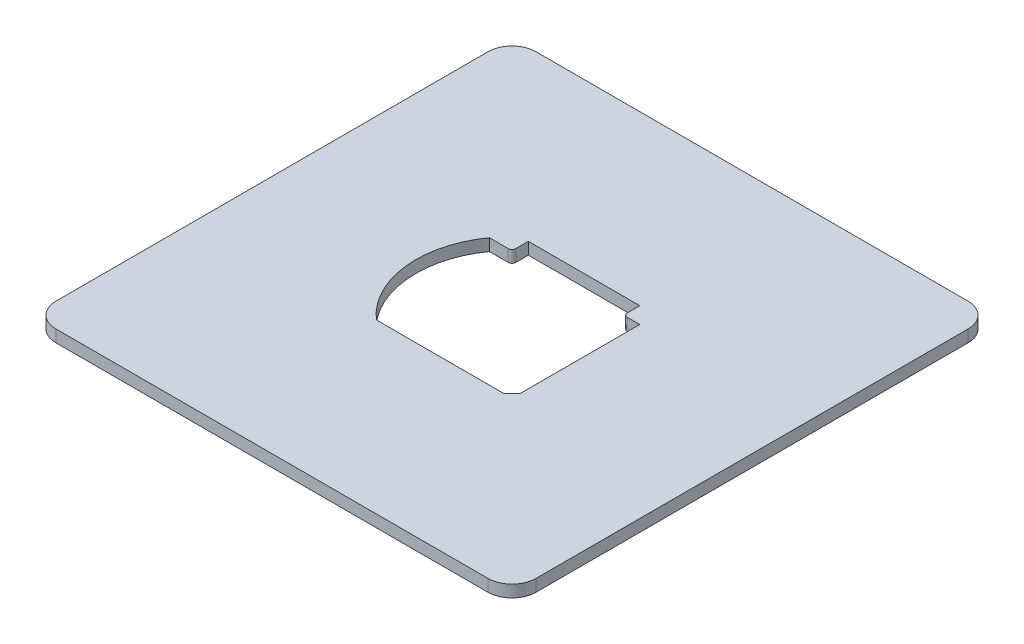
ISO-10303-21;
HEADER;
FILE_DESCRIPTION(('STEP AP214'),'2;1');
FILE_NAME('part.step','',(''),(''),'','','');
FILE_SCHEMA(('AUTOMOTIVE_DESIGN { 1 0 10303 214 1 1 1 1 }'));
ENDSEC;
DATA;
#1=APPLICATION_CONTEXT('core data for automotive mechanical design processes');
#2=APPLICATION_PROTOCOL_DEFINITION('international standard','automotive_design',2000,#1);
#3=PRODUCT_CONTEXT('',#1,'mechanical');
#4=PRODUCT('Part','Part','',(#3));
#5=PRODUCT_RELATED_PRODUCT_CATEGORY('part','',(#4));
#6=PRODUCT_DEFINITION_FORMATION('','',#4);
#7=PRODUCT_DEFINITION_CONTEXT('part definition',#1,'design');
#8=PRODUCT_DEFINITION('design','',#6,#7);
#9=PRODUCT_DEFINITION_SHAPE('','',#8);
#10=(LENGTH_UNIT() NAMED_UNIT(*) SI_UNIT(.MILLI.,.METRE.));
#11=(NAMED_UNIT(*) PLANE_ANGLE_UNIT() SI_UNIT($,.RADIAN.));
#12=(NAMED_UNIT(*) SI_UNIT($,.STERADIAN.) SOLID_ANGLE_UNIT());
#13=UNCERTAINTY_MEASURE_WITH_UNIT(LENGTH_MEASURE(1.E-05),#10,'distance_accuracy_value','');
#14=(GEOMETRIC_REPRESENTATION_CONTEXT(3) GLOBAL_UNCERTAINTY_ASSIGNED_CONTEXT((#13)) GLOBAL_UNIT_ASSIGNED_CONTEXT((#10,
#11,#12)) REPRESENTATION_CONTEXT('',''));
#15=CARTESIAN_POINT('',(0.,0.,0.));
#16=DIRECTION('',(0.,0.,1.));
#17=DIRECTION('',(1.,0.,0.));
#18=AXIS2_PLACEMENT_3D('',#15,#16,#17);
#19=CARTESIAN_POINT('',(0.,1.5875,0.));
#20=DIRECTION('',(0.,-1.,0.));
#21=DIRECTION('',(0.,0.,-1.));
#22=AXIS2_PLACEMENT_3D('',#19,#20,#21);
#23=PLANE('',#22);
#24=DIRECTION('',(1.,0.,0.));
#25=VECTOR('',#24,1.);
#26=CARTESIAN_POINT('',(0.,1.5875,0.));
#27=LINE('',#26,#25);
#28=CARTESIAN_POINT('',(3.175,1.5875,0.));
#29=VERTEX_POINT('',#28);
#30=CARTESIAN_POINT('',(60.325,1.5875,0.));
#31=VERTEX_POINT('',#30);
#32=EDGE_CURVE('E278',#29,#31,#27,.T.);
#33=ORIENTED_EDGE('',*,*,#32,.T.);
#34=CARTESIAN_POINT('',(60.325,1.5875,-3.175));
#35=DIRECTION('',(0.,-1.,0.));
#36=DIRECTION('',(0.,0.,-1.));
#37=AXIS2_PLACEMENT_3D('',#34,#35,#36);
#38=CIRCLE('',#37,3.175);
#39=CARTESIAN_POINT('',(63.5,1.5875,-3.175));
#40=VERTEX_POINT('',#39);
#41=EDGE_CURVE('E362',#31,#40,#38,.F.);
#42=ORIENTED_EDGE('',*,*,#41,.T.);
#43=DIRECTION('',(0.,0.,-1.));
#44=VECTOR('',#43,1.);
#45=CARTESIAN_POINT('',(63.5,1.5875,0.));
#46=LINE('',#45,#44);
#47=CARTESIAN_POINT('',(63.5,1.5875,-60.325));
#48=VERTEX_POINT('',#47);
#49=EDGE_CURVE('E283',#40,#48,#46,.T.);
#50=ORIENTED_EDGE('',*,*,#49,.T.);
#51=CARTESIAN_POINT('',(60.325,1.5875,-60.325));
#52=DIRECTION('',(0.,-1.,0.));
#53=DIRECTION('',(0.,0.,-1.));
#54=AXIS2_PLACEMENT_3D('',#51,#52,#53);
#55=CIRCLE('',#54,3.175);
#56=CARTESIAN_POINT('',(60.325,1.5875,-63.5));
#57=VERTEX_POINT('',#56);
#58=EDGE_CURVE('E62',#48,#57,#55,.F.);
#59=ORIENTED_EDGE('',*,*,#58,.T.);
#60=DIRECTION('',(-1.,0.,0.));
#61=VECTOR('',#60,1.);
#62=CARTESIAN_POINT('',(0.,1.5875,-63.5));
#63=LINE('',#62,#61);
#64=CARTESIAN_POINT('',(3.175,1.5875,-63.5));
#65=VERTEX_POINT('',#64);
#66=EDGE_CURVE('E286',#57,#65,#63,.T.);
#67=ORIENTED_EDGE('',*,*,#66,.T.);
#68=CARTESIAN_POINT('',(3.175,1.5875,-60.325));
#69=DIRECTION('',(0.,-1.,0.));
#70=DIRECTION('',(0.,0.,-1.));
#71=AXIS2_PLACEMENT_3D('',#68,#69,#70);
#72=CIRCLE('',#71,3.175);
#73=CARTESIAN_POINT('',(0.,1.5875,-60.325));
#74=VERTEX_POINT('',#73);
#75=EDGE_CURVE('E357',#65,#74,#72,.F.);
#76=ORIENTED_EDGE('',*,*,#75,.T.);
#77=DIRECTION('',(0.,0.,1.));
#78=VECTOR('',#77,1.);
#79=CARTESIAN_POINT('',(0.,1.5875,0.));
#80=LINE('',#79,#78);
#81=CARTESIAN_POINT('',(0.,1.5875,-3.175));
#82=VERTEX_POINT('',#81);
#83=EDGE_CURVE('E274',#74,#82,#80,.T.);
#84=ORIENTED_EDGE('',*,*,#83,.T.);
#85=CARTESIAN_POINT('',(3.175,1.5875,-3.175));
#86=DIRECTION('',(0.,-1.,0.));
#87=DIRECTION('',(0.,0.,-1.));
#88=AXIS2_PLACEMENT_3D('',#85,#86,#87);
#89=CIRCLE('',#88,3.175);
#90=EDGE_CURVE('E354',#82,#29,#89,.F.);
#91=ORIENTED_EDGE('',*,*,#90,.T.);
#92=EDGE_LOOP('',(#33,#42,#50,#59,#67,#76,#84,#91));
#93=FACE_BOUND('',#92,.T.);
#94=DIRECTION('',(0.,0.,-1.));
#95=VECTOR('',#94,1.);
#96=CARTESIAN_POINT('',(39.116,1.5875,-41.275));
#97=LINE('',#96,#95);
#98=CARTESIAN_POINT('',(39.116,1.5875,-39.6239999999999));
#99=VERTEX_POINT('',#98);
#100=CARTESIAN_POINT('',(39.116,1.5875,-41.275));
#101=VERTEX_POINT('',#100);
#102=EDGE_CURVE('E214',#99,#101,#97,.T.);
#103=ORIENTED_EDGE('',*,*,#102,.F.);
#104=CARTESIAN_POINT('',(39.624,1.5875,-39.6239999999999));
#105=DIRECTION('',(0.,-1.,0.));
#106=DIRECTION('',(0.,0.,-1.));
#107=AXIS2_PLACEMENT_3D('',#104,#105,#106);
#108=CIRCLE('',#107,0.508);
#109=CARTESIAN_POINT('',(39.624,1.5875,-39.1159999999999));
#110=VERTEX_POINT('',#109);
#111=EDGE_CURVE('E318',#99,#110,#108,.F.);
#112=ORIENTED_EDGE('',*,*,#111,.T.);
#113=DIRECTION('',(-1.,0.,0.));
#114=VECTOR('',#113,1.);
#115=CARTESIAN_POINT('',(39.116,1.5875,-39.1159999999999));
#116=LINE('',#115,#114);
#117=CARTESIAN_POINT('',(41.275,1.5875,-39.1159999999999));
#118=VERTEX_POINT('',#117);
#119=EDGE_CURVE('E210',#118,#110,#116,.T.);
#120=ORIENTED_EDGE('',*,*,#119,.F.);
#121=DIRECTION('',(0.,0.,-1.));
#122=VECTOR('',#121,1.);
#123=CARTESIAN_POINT('',(41.275,1.5875,-39.1159999999999));
#124=LINE('',#123,#122);
#125=CARTESIAN_POINT('',(41.275,1.5875,-23.3305513072411));
#126=VERTEX_POINT('',#125);
#127=EDGE_CURVE('E205',#126,#118,#124,.T.);
#128=ORIENTED_EDGE('',*,*,#127,.F.);
#129=CARTESIAN_POINT('',(31.75,1.5875,-31.75));
#130=DIRECTION('',(0.,1.,0.));
#131=DIRECTION('',(0.,0.,1.));
#132=AXIS2_PLACEMENT_3D('',#129,#130,#131);
#133=CIRCLE('',#132,12.7127);
#134=CARTESIAN_POINT('',(40.1694486927589,1.5875,-22.225));
#135=VERTEX_POINT('',#134);
#136=EDGE_CURVE('E201',#135,#126,#133,.T.);
#137=ORIENTED_EDGE('',*,*,#136,.F.);
#138=DIRECTION('',(1.,0.,0.));
#139=VECTOR('',#138,1.);
#140=CARTESIAN_POINT('',(23.3305513072411,1.5875,-22.225));
#141=LINE('',#140,#139);
#142=CARTESIAN_POINT('',(23.3305513072411,1.5875,-22.225));
#143=VERTEX_POINT('',#142);
#144=EDGE_CURVE('E186',#143,#135,#141,.T.);
#145=ORIENTED_EDGE('',*,*,#144,.F.);
#146=CARTESIAN_POINT('',(31.75,1.5875,-31.75));
#147=DIRECTION('',(0.,1.,0.));
#148=DIRECTION('',(0.,0.,1.));
#149=AXIS2_PLACEMENT_3D('',#146,#147,#148);
#150=CIRCLE('',#149,12.7127);
#151=CARTESIAN_POINT('',(21.3887845650232,1.5875,-39.1159999999999));
#152=VERTEX_POINT('',#151);
#153=EDGE_CURVE('E174',#152,#143,#150,.T.);
#154=ORIENTED_EDGE('',*,*,#153,.F.);
#155=DIRECTION('',(-1.,0.,0.));
#156=VECTOR('',#155,1.);
#157=CARTESIAN_POINT('',(24.384,1.5875,-39.1159999999999));
#158=LINE('',#157,#156);
#159=CARTESIAN_POINT('',(23.876,1.5875,-39.1159999999999));
#160=VERTEX_POINT('',#159);
#161=EDGE_CURVE('E224',#160,#152,#158,.T.);
#162=ORIENTED_EDGE('',*,*,#161,.F.);
#163=CARTESIAN_POINT('',(23.876,1.5875,-39.6239999999999));
#164=DIRECTION('',(0.,-1.,0.));
#165=DIRECTION('',(0.,0.,-1.));
#166=AXIS2_PLACEMENT_3D('',#163,#164,#165);
#167=CIRCLE('',#166,0.508);
#168=CARTESIAN_POINT('',(24.384,1.5875,-39.6239999999999));
#169=VERTEX_POINT('',#168);
#170=EDGE_CURVE('E315',#160,#169,#167,.F.);
#171=ORIENTED_EDGE('',*,*,#170,.T.);
#172=DIRECTION('',(0.,0.,1.));
#173=VECTOR('',#172,1.);
#174=CARTESIAN_POINT('',(24.384,1.5875,-41.275));
#175=LINE('',#174,#173);
#176=CARTESIAN_POINT('',(24.384,1.5875,-41.275));
#177=VERTEX_POINT('',#176);
#178=EDGE_CURVE('E220',#177,#169,#175,.T.);
#179=ORIENTED_EDGE('',*,*,#178,.F.);
#180=DIRECTION('',(-1.,0.,0.));
#181=VECTOR('',#180,1.);
#182=CARTESIAN_POINT('',(24.384,1.5875,-41.275));
#183=LINE('',#182,#181);
#184=EDGE_CURVE('E217',#101,#177,#183,.T.);
#185=ORIENTED_EDGE('',*,*,#184,.F.);
#186=EDGE_LOOP('',(#103,#112,#120,#128,#137,#145,#154,#162,#171,#179,#185));
#187=FACE_BOUND('',#186,.T.);
#188=ADVANCED_FACE('F39',(#93,#187),#23,.F.);
#189=CARTESIAN_POINT('',(0.,0.,0.));
#190=DIRECTION('',(0.,-1.,0.));
#191=DIRECTION('',(0.,0.,-1.));
#192=AXIS2_PLACEMENT_3D('',#189,#190,#191);
#193=PLANE('',#192);
#194=DIRECTION('',(0.,0.,-1.));
#195=VECTOR('',#194,1.);
#196=CARTESIAN_POINT('',(63.5,0.,0.));
#197=LINE('',#196,#195);
#198=CARTESIAN_POINT('',(63.5,0.,-3.175));
#199=VERTEX_POINT('',#198);
#200=CARTESIAN_POINT('',(63.5,0.,-60.325));
#201=VERTEX_POINT('',#200);
#202=EDGE_CURVE('E297',#199,#201,#197,.T.);
#203=ORIENTED_EDGE('',*,*,#202,.F.);
#204=CARTESIAN_POINT('',(60.325,0.,-3.175));
#205=DIRECTION('',(0.,-1.,0.));
#206=DIRECTION('',(0.,0.,-1.));
#207=AXIS2_PLACEMENT_3D('',#204,#205,#206);
#208=CIRCLE('',#207,3.175);
#209=CARTESIAN_POINT('',(60.325,0.,0.));
#210=VERTEX_POINT('',#209);
#211=EDGE_CURVE('E344',#199,#210,#208,.T.);
#212=ORIENTED_EDGE('',*,*,#211,.T.);
#213=DIRECTION('',(1.,0.,0.));
#214=VECTOR('',#213,1.);
#215=CARTESIAN_POINT('',(0.,0.,0.));
#216=LINE('',#215,#214);
#217=CARTESIAN_POINT('',(3.175,0.,0.));
#218=VERTEX_POINT('',#217);
#219=EDGE_CURVE('E293',#218,#210,#216,.T.);
#220=ORIENTED_EDGE('',*,*,#219,.F.);
#221=CARTESIAN_POINT('',(3.175,0.,-3.175));
#222=DIRECTION('',(0.,-1.,0.));
#223=DIRECTION('',(0.,0.,-1.));
#224=AXIS2_PLACEMENT_3D('',#221,#222,#223);
#225=CIRCLE('',#224,3.175);
#226=CARTESIAN_POINT('',(0.,0.,-3.175));
#227=VERTEX_POINT('',#226);
#228=EDGE_CURVE('E335',#218,#227,#225,.T.);
#229=ORIENTED_EDGE('',*,*,#228,.T.);
#230=DIRECTION('',(0.,0.,1.));
#231=VECTOR('',#230,1.);
#232=CARTESIAN_POINT('',(0.,0.,0.));
#233=LINE('',#232,#231);
#234=CARTESIAN_POINT('',(0.,0.,-60.325));
#235=VERTEX_POINT('',#234);
#236=EDGE_CURVE('E195',#235,#227,#233,.T.);
#237=ORIENTED_EDGE('',*,*,#236,.F.);
#238=CARTESIAN_POINT('',(3.175,0.,-60.325));
#239=DIRECTION('',(0.,-1.,0.));
#240=DIRECTION('',(0.,0.,-1.));
#241=AXIS2_PLACEMENT_3D('',#238,#239,#240);
#242=CIRCLE('',#241,3.175);
#243=CARTESIAN_POINT('',(3.175,0.,-63.5));
#244=VERTEX_POINT('',#243);
#245=EDGE_CURVE('E338',#235,#244,#242,.T.);
#246=ORIENTED_EDGE('',*,*,#245,.T.);
#247=DIRECTION('',(-1.,0.,0.));
#248=VECTOR('',#247,1.);
#249=CARTESIAN_POINT('',(0.,0.,-63.5));
#250=LINE('',#249,#248);
#251=CARTESIAN_POINT('',(60.325,0.,-63.5));
#252=VERTEX_POINT('',#251);
#253=EDGE_CURVE('E279',#252,#244,#250,.T.);
#254=ORIENTED_EDGE('',*,*,#253,.F.);
#255=CARTESIAN_POINT('',(60.325,0.,-60.325));
#256=DIRECTION('',(0.,-1.,0.));
#257=DIRECTION('',(0.,0.,-1.));
#258=AXIS2_PLACEMENT_3D('',#255,#256,#257);
#259=CIRCLE('',#258,3.175);
#260=EDGE_CURVE('E341',#252,#201,#259,.T.);
#261=ORIENTED_EDGE('',*,*,#260,.T.);
#262=EDGE_LOOP('',(#203,#212,#220,#229,#237,#246,#254,#261));
#263=FACE_BOUND('',#262,.T.);
#264=DIRECTION('',(-1.,0.,0.));
#265=VECTOR('',#264,1.);
#266=CARTESIAN_POINT('',(39.116,0.,-39.1159999999999));
#267=LINE('',#266,#265);
#268=CARTESIAN_POINT('',(41.275,0.,-39.1159999999999));
#269=VERTEX_POINT('',#268);
#270=CARTESIAN_POINT('',(39.624,0.,-39.1159999999999));
#271=VERTEX_POINT('',#270);
#272=EDGE_CURVE('E240',#269,#271,#267,.T.);
#273=ORIENTED_EDGE('',*,*,#272,.T.);
#274=CARTESIAN_POINT('',(39.624,0.,-39.6239999999999));
#275=DIRECTION('',(0.,-1.,0.));
#276=DIRECTION('',(0.,0.,-1.));
#277=AXIS2_PLACEMENT_3D('',#274,#275,#276);
#278=CIRCLE('',#277,0.508);
#279=CARTESIAN_POINT('',(39.116,0.,-39.6239999999999));
#280=VERTEX_POINT('',#279);
#281=EDGE_CURVE('E309',#271,#280,#278,.T.);
#282=ORIENTED_EDGE('',*,*,#281,.T.);
#283=DIRECTION('',(0.,0.,-1.));
#284=VECTOR('',#283,1.);
#285=CARTESIAN_POINT('',(39.116,0.,-41.275));
#286=LINE('',#285,#284);
#287=CARTESIAN_POINT('',(39.116,0.,-41.275));
#288=VERTEX_POINT('',#287);
#289=EDGE_CURVE('E244',#280,#288,#286,.T.);
#290=ORIENTED_EDGE('',*,*,#289,.T.);
#291=DIRECTION('',(-1.,0.,0.));
#292=VECTOR('',#291,1.);
#293=CARTESIAN_POINT('',(24.384,0.,-41.275));
#294=LINE('',#293,#292);
#295=CARTESIAN_POINT('',(24.384,0.,-41.275));
#296=VERTEX_POINT('',#295);
#297=EDGE_CURVE('E247',#288,#296,#294,.T.);
#298=ORIENTED_EDGE('',*,*,#297,.T.);
#299=DIRECTION('',(0.,0.,1.));
#300=VECTOR('',#299,1.);
#301=CARTESIAN_POINT('',(24.384,0.,-41.275));
#302=LINE('',#301,#300);
#303=CARTESIAN_POINT('',(24.384,0.,-39.6239999999999));
#304=VERTEX_POINT('',#303);
#305=EDGE_CURVE('E251',#296,#304,#302,.T.);
#306=ORIENTED_EDGE('',*,*,#305,.T.);
#307=CARTESIAN_POINT('',(23.876,0.,-39.6239999999999));
#308=DIRECTION('',(0.,-1.,0.));
#309=DIRECTION('',(0.,0.,-1.));
#310=AXIS2_PLACEMENT_3D('',#307,#308,#309);
#311=CIRCLE('',#310,0.508);
#312=CARTESIAN_POINT('',(23.876,0.,-39.1159999999999));
#313=VERTEX_POINT('',#312);
#314=EDGE_CURVE('E306',#304,#313,#311,.T.);
#315=ORIENTED_EDGE('',*,*,#314,.T.);
#316=DIRECTION('',(-1.,0.,0.));
#317=VECTOR('',#316,1.);
#318=CARTESIAN_POINT('',(24.384,0.,-39.1159999999999));
#319=LINE('',#318,#317);
#320=CARTESIAN_POINT('',(21.3887845650232,0.,-39.1159999999999));
#321=VERTEX_POINT('',#320);
#322=EDGE_CURVE('E187',#313,#321,#319,.T.);
#323=ORIENTED_EDGE('',*,*,#322,.T.);
#324=CARTESIAN_POINT('',(31.75,0.,-31.75));
#325=DIRECTION('',(0.,1.,0.));
#326=DIRECTION('',(0.,0.,1.));
#327=AXIS2_PLACEMENT_3D('',#324,#325,#326);
#328=CIRCLE('',#327,12.7127);
#329=CARTESIAN_POINT('',(23.3305513072411,0.,-22.225));
#330=VERTEX_POINT('',#329);
#331=EDGE_CURVE('E227',#321,#330,#328,.T.);
#332=ORIENTED_EDGE('',*,*,#331,.T.);
#333=DIRECTION('',(1.,0.,0.));
#334=VECTOR('',#333,1.);
#335=CARTESIAN_POINT('',(23.3305513072411,0.,-22.225));
#336=LINE('',#335,#334);
#337=CARTESIAN_POINT('',(40.1694486927589,0.,-22.225));
#338=VERTEX_POINT('',#337);
#339=EDGE_CURVE('E193',#330,#338,#336,.T.);
#340=ORIENTED_EDGE('',*,*,#339,.T.);
#341=CARTESIAN_POINT('',(31.75,0.,-31.75));
#342=DIRECTION('',(0.,1.,0.));
#343=DIRECTION('',(0.,0.,1.));
#344=AXIS2_PLACEMENT_3D('',#341,#342,#343);
#345=CIRCLE('',#344,12.7127);
#346=CARTESIAN_POINT('',(41.275,0.,-23.3305513072411));
#347=VERTEX_POINT('',#346);
#348=EDGE_CURVE('E232',#338,#347,#345,.T.);
#349=ORIENTED_EDGE('',*,*,#348,.T.);
#350=DIRECTION('',(0.,0.,-1.));
#351=VECTOR('',#350,1.);
#352=CARTESIAN_POINT('',(41.275,0.,-39.1159999999999));
#353=LINE('',#352,#351);
#354=EDGE_CURVE('E236',#347,#269,#353,.T.);
#355=ORIENTED_EDGE('',*,*,#354,.T.);
#356=EDGE_LOOP('',(#273,#282,#290,#298,#306,#315,#323,#332,#340,#349,#355));
#357=FACE_BOUND('',#356,.T.);
#358=ADVANCED_FACE('F388',(#263,#357),#193,.T.);
#359=CARTESIAN_POINT('',(0.,1.5875,0.));
#360=DIRECTION('',(1.,0.,0.));
#361=DIRECTION('',(0.,0.,-1.));
#362=AXIS2_PLACEMENT_3D('',#359,#360,#361);
#363=PLANE('',#362);
#364=ORIENTED_EDGE('',*,*,#83,.F.);
#365=DIRECTION('',(0.,-1.,0.));
#366=VECTOR('',#365,1.);
#367=CARTESIAN_POINT('',(0.,1.5875,-60.325));
#368=LINE('',#367,#366);
#369=EDGE_CURVE('E11',#74,#235,#368,.T.);
#370=ORIENTED_EDGE('',*,*,#369,.T.);
#371=ORIENTED_EDGE('',*,*,#236,.T.);
#372=DIRECTION('',(0.,-1.,0.));
#373=VECTOR('',#372,1.);
#374=CARTESIAN_POINT('',(0.,1.5875,-3.175));
#375=LINE('',#374,#373);
#376=EDGE_CURVE('E48',#227,#82,#375,.F.);
#377=ORIENTED_EDGE('',*,*,#376,.T.);
#378=EDGE_LOOP('',(#364,#370,#371,#377));
#379=FACE_BOUND('',#378,.T.);
#380=ADVANCED_FACE('F374',(#379),#363,.F.);
#381=CARTESIAN_POINT('',(0.,1.5875,0.));
#382=DIRECTION('',(0.,0.,-1.));
#383=DIRECTION('',(-1.,0.,0.));
#384=AXIS2_PLACEMENT_3D('',#381,#382,#383);
#385=PLANE('',#384);
#386=ORIENTED_EDGE('',*,*,#219,.T.);
#387=DIRECTION('',(0.,-1.,0.));
#388=VECTOR('',#387,1.);
#389=CARTESIAN_POINT('',(60.325,1.5875,0.));
#390=LINE('',#389,#388);
#391=EDGE_CURVE('E351',#210,#31,#390,.F.);
#392=ORIENTED_EDGE('',*,*,#391,.T.);
#393=ORIENTED_EDGE('',*,*,#32,.F.);
#394=DIRECTION('',(0.,-1.,0.));
#395=VECTOR('',#394,1.);
#396=CARTESIAN_POINT('',(3.175,1.5875,0.));
#397=LINE('',#396,#395);
#398=EDGE_CURVE('E347',#29,#218,#397,.T.);
#399=ORIENTED_EDGE('',*,*,#398,.T.);
#400=EDGE_LOOP('',(#386,#392,#393,#399));
#401=FACE_BOUND('',#400,.T.);
#402=ADVANCED_FACE('F384',(#401),#385,.F.);
#403=CARTESIAN_POINT('',(63.5,1.5875,0.));
#404=DIRECTION('',(-1.,0.,0.));
#405=DIRECTION('',(0.,0.,1.));
#406=AXIS2_PLACEMENT_3D('',#403,#404,#405);
#407=PLANE('',#406);
#408=ORIENTED_EDGE('',*,*,#49,.F.);
#409=DIRECTION('',(0.,-1.,0.));
#410=VECTOR('',#409,1.);
#411=CARTESIAN_POINT('',(63.5,1.5875,-3.175));
#412=LINE('',#411,#410);
#413=EDGE_CURVE('E331',#40,#199,#412,.T.);
#414=ORIENTED_EDGE('',*,*,#413,.T.);
#415=ORIENTED_EDGE('',*,*,#202,.T.);
#416=DIRECTION('',(0.,-1.,0.));
#417=VECTOR('',#416,1.);
#418=CARTESIAN_POINT('',(63.5,1.5875,-60.325));
#419=LINE('',#418,#417);
#420=EDGE_CURVE('E328',#201,#48,#419,.F.);
#421=ORIENTED_EDGE('',*,*,#420,.T.);
#422=EDGE_LOOP('',(#408,#414,#415,#421));
#423=FACE_BOUND('',#422,.T.);
#424=ADVANCED_FACE('F396',(#423),#407,.F.);
#425=CARTESIAN_POINT('',(0.,1.5875,-63.5));
#426=DIRECTION('',(0.,0.,1.));
#427=DIRECTION('',(1.,0.,0.));
#428=AXIS2_PLACEMENT_3D('',#425,#426,#427);
#429=PLANE('',#428);
#430=ORIENTED_EDGE('',*,*,#66,.F.);
#431=DIRECTION('',(0.,-1.,0.));
#432=VECTOR('',#431,1.);
#433=CARTESIAN_POINT('',(60.325,1.5875,-63.5));
#434=LINE('',#433,#432);
#435=EDGE_CURVE('E367',#57,#252,#434,.T.);
#436=ORIENTED_EDGE('',*,*,#435,.T.);
#437=ORIENTED_EDGE('',*,*,#253,.T.);
#438=DIRECTION('',(0.,-1.,0.));
#439=VECTOR('',#438,1.);
#440=CARTESIAN_POINT('',(3.175,1.5875,-63.5));
#441=LINE('',#440,#439);
#442=EDGE_CURVE('E55',#244,#65,#441,.F.);
#443=ORIENTED_EDGE('',*,*,#442,.T.);
#444=EDGE_LOOP('',(#430,#436,#437,#443));
#445=FACE_BOUND('',#444,.T.);
#446=ADVANCED_FACE('F402',(#445),#429,.F.);
#447=CARTESIAN_POINT('',(31.75,1.5875,-31.75));
#448=DIRECTION('',(0.,-1.,0.));
#449=DIRECTION('',(0.,0.,-1.));
#450=AXIS2_PLACEMENT_3D('',#447,#448,#449);
#451=CYLINDRICAL_SURFACE('',#450,12.7127);
#452=ORIENTED_EDGE('',*,*,#331,.F.);
#453=DIRECTION('',(0.,-1.,0.));
#454=VECTOR('',#453,1.);
#455=CARTESIAN_POINT('',(21.3887845650232,1.5875,-39.1159999999999));
#456=LINE('',#455,#454);
#457=EDGE_CURVE('E181',#152,#321,#456,.T.);
#458=ORIENTED_EDGE('',*,*,#457,.F.);
#459=ORIENTED_EDGE('',*,*,#153,.T.);
#460=DIRECTION('',(0.,-1.,0.));
#461=VECTOR('',#460,1.);
#462=CARTESIAN_POINT('',(23.3305513072411,1.5875,-22.225));
#463=LINE('',#462,#461);
#464=EDGE_CURVE('E178',#143,#330,#463,.T.);
#465=ORIENTED_EDGE('',*,*,#464,.T.);
#466=EDGE_LOOP('',(#452,#458,#459,#465));
#467=FACE_BOUND('',#466,.T.);
#468=ADVANCED_FACE('F177',(#467),#451,.F.);
#469=CARTESIAN_POINT('',(23.3305513072411,1.5875,-22.225));
#470=DIRECTION('',(0.,0.,-1.));
#471=DIRECTION('',(-1.,0.,0.));
#472=AXIS2_PLACEMENT_3D('',#469,#470,#471);
#473=PLANE('',#472);
#474=ORIENTED_EDGE('',*,*,#339,.F.);
#475=ORIENTED_EDGE('',*,*,#464,.F.);
#476=ORIENTED_EDGE('',*,*,#144,.T.);
#477=DIRECTION('',(0.,-1.,0.));
#478=VECTOR('',#477,1.);
#479=CARTESIAN_POINT('',(40.1694486927589,1.5875,-22.225));
#480=LINE('',#479,#478);
#481=EDGE_CURVE('E196',#135,#338,#480,.T.);
#482=ORIENTED_EDGE('',*,*,#481,.T.);
#483=EDGE_LOOP('',(#474,#475,#476,#482));
#484=FACE_BOUND('',#483,.T.);
#485=ADVANCED_FACE('F190',(#484),#473,.T.);
#486=CARTESIAN_POINT('',(31.75,1.5875,-31.75));
#487=DIRECTION('',(0.,-1.,0.));
#488=DIRECTION('',(0.,0.,-1.));
#489=AXIS2_PLACEMENT_3D('',#486,#487,#488);
#490=CYLINDRICAL_SURFACE('',#489,12.7127);
#491=ORIENTED_EDGE('',*,*,#348,.F.);
#492=ORIENTED_EDGE('',*,*,#481,.F.);
#493=ORIENTED_EDGE('',*,*,#136,.T.);
#494=DIRECTION('',(0.,-1.,0.));
#495=VECTOR('',#494,1.);
#496=CARTESIAN_POINT('',(41.275,1.5875,-23.3305513072411));
#497=LINE('',#496,#495);
#498=EDGE_CURVE('E269',#126,#347,#497,.T.);
#499=ORIENTED_EDGE('',*,*,#498,.T.);
#500=EDGE_LOOP('',(#491,#492,#493,#499));
#501=FACE_BOUND('',#500,.T.);
#502=ADVANCED_FACE('F523',(#501),#490,.F.);
#503=CARTESIAN_POINT('',(41.275,1.5875,-39.1159999999999));
#504=DIRECTION('',(-1.,0.,0.));
#505=DIRECTION('',(0.,0.,1.));
#506=AXIS2_PLACEMENT_3D('',#503,#504,#505);
#507=PLANE('',#506);
#508=ORIENTED_EDGE('',*,*,#354,.F.);
#509=ORIENTED_EDGE('',*,*,#498,.F.);
#510=ORIENTED_EDGE('',*,*,#127,.T.);
#511=DIRECTION('',(0.,-1.,0.));
#512=VECTOR('',#511,1.);
#513=CARTESIAN_POINT('',(41.275,1.5875,-39.1159999999999));
#514=LINE('',#513,#512);
#515=EDGE_CURVE('E266',#118,#269,#514,.T.);
#516=ORIENTED_EDGE('',*,*,#515,.T.);
#517=EDGE_LOOP('',(#508,#509,#510,#516));
#518=FACE_BOUND('',#517,.T.);
#519=ADVANCED_FACE('F515',(#518),#507,.T.);
#520=CARTESIAN_POINT('',(39.116,1.5875,-39.1159999999999));
#521=DIRECTION('',(0.,0.,1.));
#522=DIRECTION('',(1.,0.,0.));
#523=AXIS2_PLACEMENT_3D('',#520,#521,#522);
#524=PLANE('',#523);
#525=ORIENTED_EDGE('',*,*,#119,.T.);
#526=DIRECTION('',(0.,-1.,0.));
#527=VECTOR('',#526,1.);
#528=CARTESIAN_POINT('',(39.624,1.5875,-39.1159999999999));
#529=LINE('',#528,#527);
#530=EDGE_CURVE('E289',#110,#271,#529,.T.);
#531=ORIENTED_EDGE('',*,*,#530,.T.);
#532=ORIENTED_EDGE('',*,*,#272,.F.);
#533=ORIENTED_EDGE('',*,*,#515,.F.);
#534=EDGE_LOOP('',(#525,#531,#532,#533));
#535=FACE_BOUND('',#534,.T.);
#536=ADVANCED_FACE('F507',(#535),#524,.T.);
#537=CARTESIAN_POINT('',(39.116,1.5875,-41.275));
#538=DIRECTION('',(-1.,0.,0.));
#539=DIRECTION('',(0.,0.,1.));
#540=AXIS2_PLACEMENT_3D('',#537,#538,#539);
#541=PLANE('',#540);
#542=ORIENTED_EDGE('',*,*,#289,.F.);
#543=DIRECTION('',(0.,-1.,0.));
#544=VECTOR('',#543,1.);
#545=CARTESIAN_POINT('',(39.116,1.5875,-39.6239999999999));
#546=LINE('',#545,#544);
#547=EDGE_CURVE('E312',#280,#99,#546,.F.);
#548=ORIENTED_EDGE('',*,*,#547,.T.);
#549=ORIENTED_EDGE('',*,*,#102,.T.);
#550=DIRECTION('',(0.,-1.,0.));
#551=VECTOR('',#550,1.);
#552=CARTESIAN_POINT('',(39.116,1.5875,-41.275));
#553=LINE('',#552,#551);
#554=EDGE_CURVE('E262',#101,#288,#553,.T.);
#555=ORIENTED_EDGE('',*,*,#554,.T.);
#556=EDGE_LOOP('',(#542,#548,#549,#555));
#557=FACE_BOUND('',#556,.T.);
#558=ADVANCED_FACE('F497',(#557),#541,.T.);
#559=CARTESIAN_POINT('',(24.384,1.5875,-41.275));
#560=DIRECTION('',(0.,0.,1.));
#561=DIRECTION('',(1.,0.,0.));
#562=AXIS2_PLACEMENT_3D('',#559,#560,#561);
#563=PLANE('',#562);
#564=ORIENTED_EDGE('',*,*,#297,.F.);
#565=ORIENTED_EDGE('',*,*,#554,.F.);
#566=ORIENTED_EDGE('',*,*,#184,.T.);
#567=DIRECTION('',(0.,-1.,0.));
#568=VECTOR('',#567,1.);
#569=CARTESIAN_POINT('',(24.384,1.5875,-41.275));
#570=LINE('',#569,#568);
#571=EDGE_CURVE('E259',#177,#296,#570,.T.);
#572=ORIENTED_EDGE('',*,*,#571,.T.);
#573=EDGE_LOOP('',(#564,#565,#566,#572));
#574=FACE_BOUND('',#573,.T.);
#575=ADVANCED_FACE('F487',(#574),#563,.T.);
#576=CARTESIAN_POINT('',(24.384,1.5875,-41.275));
#577=DIRECTION('',(1.,0.,0.));
#578=DIRECTION('',(0.,0.,-1.));
#579=AXIS2_PLACEMENT_3D('',#576,#577,#578);
#580=PLANE('',#579);
#581=ORIENTED_EDGE('',*,*,#178,.T.);
#582=DIRECTION('',(0.,-1.,0.));
#583=VECTOR('',#582,1.);
#584=CARTESIAN_POINT('',(24.384,1.5875,-39.6239999999999));
#585=LINE('',#584,#583);
#586=EDGE_CURVE('E321',#169,#304,#585,.T.);
#587=ORIENTED_EDGE('',*,*,#586,.T.);
#588=ORIENTED_EDGE('',*,*,#305,.F.);
#589=ORIENTED_EDGE('',*,*,#571,.F.);
#590=EDGE_LOOP('',(#581,#587,#588,#589));
#591=FACE_BOUND('',#590,.T.);
#592=ADVANCED_FACE('F478',(#591),#580,.T.);
#593=CARTESIAN_POINT('',(24.384,1.5875,-39.1159999999999));
#594=DIRECTION('',(0.,0.,1.));
#595=DIRECTION('',(1.,0.,0.));
#596=AXIS2_PLACEMENT_3D('',#593,#594,#595);
#597=PLANE('',#596);
#598=ORIENTED_EDGE('',*,*,#322,.F.);
#599=DIRECTION('',(0.,-1.,0.));
#600=VECTOR('',#599,1.);
#601=CARTESIAN_POINT('',(23.876,1.5875,-39.1159999999999));
#602=LINE('',#601,#600);
#603=EDGE_CURVE('E325',#313,#160,#602,.F.);
#604=ORIENTED_EDGE('',*,*,#603,.T.);
#605=ORIENTED_EDGE('',*,*,#161,.T.);
#606=ORIENTED_EDGE('',*,*,#457,.T.);
#607=EDGE_LOOP('',(#598,#604,#605,#606));
#608=FACE_BOUND('',#607,.T.);
#609=ADVANCED_FACE('F432',(#608),#597,.T.);
#610=CARTESIAN_POINT('',(39.624,1.5875,-39.6239999999999));
#611=DIRECTION('',(0.,-1.,0.));
#612=DIRECTION('',(0.,0.,-1.));
#613=AXIS2_PLACEMENT_3D('',#610,#611,#612);
#614=CYLINDRICAL_SURFACE('',#613,0.508);
#615=ORIENTED_EDGE('',*,*,#111,.F.);
#616=ORIENTED_EDGE('',*,*,#547,.F.);
#617=ORIENTED_EDGE('',*,*,#281,.F.);
#618=ORIENTED_EDGE('',*,*,#530,.F.);
#619=EDGE_LOOP('',(#615,#616,#617,#618));
#620=FACE_BOUND('',#619,.T.);
#621=ADVANCED_FACE('F428',(#620),#614,.T.);
#622=CARTESIAN_POINT('',(23.876,1.5875,-39.6239999999999));
#623=DIRECTION('',(0.,-1.,0.));
#624=DIRECTION('',(0.,0.,-1.));
#625=AXIS2_PLACEMENT_3D('',#622,#623,#624);
#626=CYLINDRICAL_SURFACE('',#625,0.508);
#627=ORIENTED_EDGE('',*,*,#170,.F.);
#628=ORIENTED_EDGE('',*,*,#603,.F.);
#629=ORIENTED_EDGE('',*,*,#314,.F.);
#630=ORIENTED_EDGE('',*,*,#586,.F.);
#631=EDGE_LOOP('',(#627,#628,#629,#630));
#632=FACE_BOUND('',#631,.T.);
#633=ADVANCED_FACE('F431',(#632),#626,.T.);
#634=CARTESIAN_POINT('',(60.325,1.5875,-3.175));
#635=DIRECTION('',(0.,-1.,0.));
#636=DIRECTION('',(0.,0.,-1.));
#637=AXIS2_PLACEMENT_3D('',#634,#635,#636);
#638=CYLINDRICAL_SURFACE('',#637,3.175);
#639=ORIENTED_EDGE('',*,*,#41,.F.);
#640=ORIENTED_EDGE('',*,*,#391,.F.);
#641=ORIENTED_EDGE('',*,*,#211,.F.);
#642=ORIENTED_EDGE('',*,*,#413,.F.);
#643=EDGE_LOOP('',(#639,#640,#641,#642));
#644=FACE_BOUND('',#643,.T.);
#645=ADVANCED_FACE('F393',(#644),#638,.T.);
#646=CARTESIAN_POINT('',(60.325,1.5875,-60.325));
#647=DIRECTION('',(0.,-1.,0.));
#648=DIRECTION('',(0.,0.,-1.));
#649=AXIS2_PLACEMENT_3D('',#646,#647,#648);
#650=CYLINDRICAL_SURFACE('',#649,3.175);
#651=ORIENTED_EDGE('',*,*,#58,.F.);
#652=ORIENTED_EDGE('',*,*,#420,.F.);
#653=ORIENTED_EDGE('',*,*,#260,.F.);
#654=ORIENTED_EDGE('',*,*,#435,.F.);
#655=EDGE_LOOP('',(#651,#652,#653,#654));
#656=FACE_BOUND('',#655,.T.);
#657=ADVANCED_FACE('F400',(#656),#650,.T.);
#658=CARTESIAN_POINT('',(3.175,1.5875,-60.325));
#659=DIRECTION('',(0.,-1.,0.));
#660=DIRECTION('',(0.,0.,-1.));
#661=AXIS2_PLACEMENT_3D('',#658,#659,#660);
#662=CYLINDRICAL_SURFACE('',#661,3.175);
#663=ORIENTED_EDGE('',*,*,#75,.F.);
#664=ORIENTED_EDGE('',*,*,#442,.F.);
#665=ORIENTED_EDGE('',*,*,#245,.F.);
#666=ORIENTED_EDGE('',*,*,#369,.F.);
#667=EDGE_LOOP('',(#663,#664,#665,#666));
#668=FACE_BOUND('',#667,.T.);
#669=ADVANCED_FACE('F404',(#668),#662,.T.);
#670=CARTESIAN_POINT('',(3.175,1.5875,-3.175));
#671=DIRECTION('',(0.,-1.,0.));
#672=DIRECTION('',(0.,0.,-1.));
#673=AXIS2_PLACEMENT_3D('',#670,#671,#672);
#674=CYLINDRICAL_SURFACE('',#673,3.175);
#675=ORIENTED_EDGE('',*,*,#90,.F.);
#676=ORIENTED_EDGE('',*,*,#376,.F.);
#677=ORIENTED_EDGE('',*,*,#228,.F.);
#678=ORIENTED_EDGE('',*,*,#398,.F.);
#679=EDGE_LOOP('',(#675,#676,#677,#678));
#680=FACE_BOUND('',#679,.T.);
#681=ADVANCED_FACE('F41',(#680),#674,.T.);
#682=CLOSED_SHELL('',(#188,#358,#380,#402,#424,#446,#468,#485,#502,#519,#536,#558,#575,#592,
#609,#621,#633,#645,#657,#669,#681));
#683=MANIFOLD_SOLID_BREP('B2',#682);
#684=ADVANCED_BREP_SHAPE_REPRESENTATION('',(#18,#683),#14);
#685=SHAPE_DEFINITION_REPRESENTATION(#9,#684);
ENDSEC;
END-ISO-10303-21;
